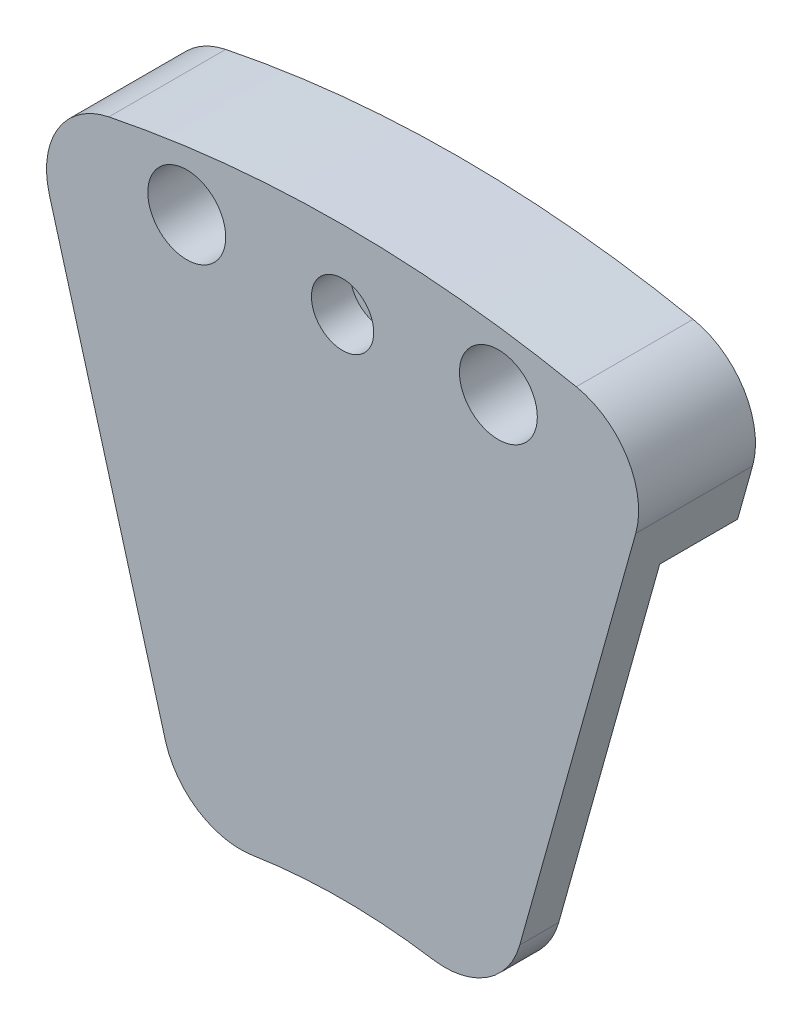
ISO-10303-21;
HEADER;
FILE_DESCRIPTION(('STEP AP214'),'2;1');
FILE_NAME('part.step','',(''),(''),'','','');
FILE_SCHEMA(('AUTOMOTIVE_DESIGN { 1 0 10303 214 1 1 1 1 }'));
ENDSEC;
DATA;
#1=APPLICATION_CONTEXT('core data for automotive mechanical design processes');
#2=APPLICATION_PROTOCOL_DEFINITION('international standard','automotive_design',2000,#1);
#3=PRODUCT_CONTEXT('',#1,'mechanical');
#4=PRODUCT('Part','Part','',(#3));
#5=PRODUCT_RELATED_PRODUCT_CATEGORY('part','',(#4));
#6=PRODUCT_DEFINITION_FORMATION('','',#4);
#7=PRODUCT_DEFINITION_CONTEXT('part definition',#1,'design');
#8=PRODUCT_DEFINITION('design','',#6,#7);
#9=PRODUCT_DEFINITION_SHAPE('','',#8);
#10=(LENGTH_UNIT() NAMED_UNIT(*) SI_UNIT(.MILLI.,.METRE.));
#11=(NAMED_UNIT(*) PLANE_ANGLE_UNIT() SI_UNIT($,.RADIAN.));
#12=(NAMED_UNIT(*) SI_UNIT($,.STERADIAN.) SOLID_ANGLE_UNIT());
#13=UNCERTAINTY_MEASURE_WITH_UNIT(LENGTH_MEASURE(1.E-05),#10,'distance_accuracy_value','');
#14=(GEOMETRIC_REPRESENTATION_CONTEXT(3) GLOBAL_UNCERTAINTY_ASSIGNED_CONTEXT((#13)) GLOBAL_UNIT_ASSIGNED_CONTEXT((#10,
#11,#12)) REPRESENTATION_CONTEXT('',''));
#15=CARTESIAN_POINT('',(0.,0.,0.));
#16=DIRECTION('',(0.,0.,1.));
#17=DIRECTION('',(1.,0.,0.));
#18=AXIS2_PLACEMENT_3D('',#15,#16,#17);
#19=CARTESIAN_POINT('',(20.,141.089510595225,-45.));
#20=DIRECTION('',(0.,0.,1.));
#21=DIRECTION('',(1.,0.,0.));
#22=AXIS2_PLACEMENT_3D('',#19,#20,#21);
#23=CYLINDRICAL_SURFACE('',#22,2.15000000000001);
#24=CARTESIAN_POINT('',(20.,141.089510595225,-10.));
#25=DIRECTION('',(0.,0.,-1.));
#26=DIRECTION('',(-1.,0.,0.));
#27=AXIS2_PLACEMENT_3D('',#24,#25,#26);
#28=CIRCLE('',#27,2.15000000000001);
#29=CARTESIAN_POINT('',(17.85,141.089510595225,-10.));
#30=VERTEX_POINT('',#29);
#31=EDGE_CURVE('E161',#30,#30,#28,.T.);
#32=ORIENTED_EDGE('',*,*,#31,.T.);
#33=EDGE_LOOP('',(#32));
#34=FACE_BOUND('',#33,.T.);
#35=CARTESIAN_POINT('',(20.,141.089510595225,-5.));
#36=DIRECTION('',(0.,0.,1.));
#37=DIRECTION('',(1.,0.,0.));
#38=AXIS2_PLACEMENT_3D('',#35,#36,#37);
#39=CIRCLE('',#38,2.15000000000001);
#40=CARTESIAN_POINT('',(22.15,141.089510595225,-5.));
#41=VERTEX_POINT('',#40);
#42=EDGE_CURVE('E39',#41,#41,#39,.F.);
#43=ORIENTED_EDGE('',*,*,#42,.F.);
#44=EDGE_LOOP('',(#43));
#45=FACE_BOUND('',#44,.T.);
#46=ADVANCED_FACE('F35',(#34,#45),#23,.F.);
#47=CARTESIAN_POINT('',(-20.,141.089510595225,-45.));
#48=DIRECTION('',(0.,0.,1.));
#49=DIRECTION('',(1.,0.,0.));
#50=AXIS2_PLACEMENT_3D('',#47,#48,#49);
#51=CYLINDRICAL_SURFACE('',#50,2.15);
#52=CARTESIAN_POINT('',(-20.,141.089510595225,-10.));
#53=DIRECTION('',(0.,0.,-1.));
#54=DIRECTION('',(-1.,0.,0.));
#55=AXIS2_PLACEMENT_3D('',#52,#53,#54);
#56=CIRCLE('',#55,2.15);
#57=CARTESIAN_POINT('',(-22.15,141.089510595225,-10.));
#58=VERTEX_POINT('',#57);
#59=EDGE_CURVE('E164',#58,#58,#56,.T.);
#60=ORIENTED_EDGE('',*,*,#59,.T.);
#61=EDGE_LOOP('',(#60));
#62=FACE_BOUND('',#61,.T.);
#63=CARTESIAN_POINT('',(-20.,141.089510595225,-5.));
#64=DIRECTION('',(0.,0.,1.));
#65=DIRECTION('',(1.,0.,0.));
#66=AXIS2_PLACEMENT_3D('',#63,#64,#65);
#67=CIRCLE('',#66,2.15);
#68=CARTESIAN_POINT('',(-17.85,141.089510595225,-5.));
#69=VERTEX_POINT('',#68);
#70=EDGE_CURVE('E166',#69,#69,#67,.F.);
#71=ORIENTED_EDGE('',*,*,#70,.F.);
#72=EDGE_LOOP('',(#71));
#73=FACE_BOUND('',#72,.T.);
#74=ADVANCED_FACE('F273',(#62,#73),#51,.F.);
#75=CARTESIAN_POINT('',(-28.,137.171425595858,0.));
#76=DIRECTION('',(0.,0.,1.));
#77=DIRECTION('',(1.,0.,0.));
#78=AXIS2_PLACEMENT_3D('',#75,#76,#77);
#79=PLANE('',#78);
#80=CARTESIAN_POINT('',(0.,-1.66533453693773E-13,0.));
#81=DIRECTION('',(0.,0.,1.));
#82=DIRECTION('',(-1.,0.,0.));
#83=AXIS2_PLACEMENT_3D('',#80,#81,#82);
#84=CIRCLE('',#83,132.5);
#85=CARTESIAN_POINT('',(35.7053798233847,127.598494707688,0.));
#86=VERTEX_POINT('',#85);
#87=CARTESIAN_POINT('',(-35.7053798233847,127.598494707688,0.));
#88=VERTEX_POINT('',#87);
#89=EDGE_CURVE('E52',#86,#88,#84,.T.);
#90=ORIENTED_EDGE('',*,*,#89,.F.);
#91=DIRECTION('',(0.269474564704791,0.963007507227832,0.));
#92=VECTOR('',#91,1.);
#93=CARTESIAN_POINT('',(22.746271228219,81.2871893056481,0.));
#94=LINE('',#93,#92);
#95=CARTESIAN_POINT('',(22.746271228219,81.2871893056481,0.));
#96=VERTEX_POINT('',#95);
#97=EDGE_CURVE('E147',#96,#86,#94,.T.);
#98=ORIENTED_EDGE('',*,*,#97,.F.);
#99=CARTESIAN_POINT('',(13.1161961559407,83.9819349526959,0.));
#100=DIRECTION('',(0.,0.,1.));
#101=DIRECTION('',(1.,0.,0.));
#102=AXIS2_PLACEMENT_3D('',#99,#100,#101);
#103=CIRCLE('',#102,9.99999999999993);
#104=CARTESIAN_POINT('',(11.5731142552418,74.1017073112023,0.));
#105=VERTEX_POINT('',#104);
#106=EDGE_CURVE('E82',#105,#96,#103,.T.);
#107=ORIENTED_EDGE('',*,*,#106,.F.);
#108=CARTESIAN_POINT('',(0.,-1.65700786425305E-13,0.));
#109=DIRECTION('',(0.,0.,-1.));
#110=DIRECTION('',(1.,0.,0.));
#111=AXIS2_PLACEMENT_3D('',#108,#109,#110);
#112=CIRCLE('',#111,75.);
#113=CARTESIAN_POINT('',(-11.5731142552418,74.1017073112023,0.));
#114=VERTEX_POINT('',#113);
#115=EDGE_CURVE('E143',#114,#105,#112,.T.);
#116=ORIENTED_EDGE('',*,*,#115,.F.);
#117=CARTESIAN_POINT('',(-13.1161961559407,83.9819349526959,0.));
#118=DIRECTION('',(0.,0.,1.));
#119=DIRECTION('',(1.,0.,0.));
#120=AXIS2_PLACEMENT_3D('',#117,#118,#119);
#121=CIRCLE('',#120,9.99999999999994);
#122=CARTESIAN_POINT('',(-22.7462712282191,81.2871893056481,0.));
#123=VERTEX_POINT('',#122);
#124=EDGE_CURVE('E140',#123,#114,#121,.T.);
#125=ORIENTED_EDGE('',*,*,#124,.F.);
#126=DIRECTION('',(0.269474564704791,-0.963007507227832,0.));
#127=VECTOR('',#126,1.);
#128=CARTESIAN_POINT('',(-37.6300750722784,134.47667994881,0.));
#129=LINE('',#128,#127);
#130=EDGE_CURVE('E138',#88,#123,#129,.T.);
#131=ORIENTED_EDGE('',*,*,#130,.F.);
#132=EDGE_LOOP('',(#90,#98,#107,#116,#125,#131));
#133=FACE_BOUND('',#132,.T.);
#134=ADVANCED_FACE('F226',(#133),#79,.F.);
#135=CARTESIAN_POINT('',(-28.,137.171425595858,5.));
#136=DIRECTION('',(0.,0.,1.));
#137=DIRECTION('',(1.,0.,0.));
#138=AXIS2_PLACEMENT_3D('',#135,#136,#137);
#139=PLANE('',#138);
#140=CARTESIAN_POINT('',(-20.,141.089510595225,5.));
#141=DIRECTION('',(0.,0.,1.));
#142=DIRECTION('',(1.,0.,0.));
#143=AXIS2_PLACEMENT_3D('',#140,#141,#142);
#144=CIRCLE('',#143,5.);
#145=CARTESIAN_POINT('',(-15.,141.089510595225,5.));
#146=VERTEX_POINT('',#145);
#147=EDGE_CURVE('E173',#146,#146,#144,.T.);
#148=ORIENTED_EDGE('',*,*,#147,.F.);
#149=EDGE_LOOP('',(#148));
#150=FACE_BOUND('',#149,.T.);
#151=CARTESIAN_POINT('',(20.,141.089510595225,5.));
#152=DIRECTION('',(0.,0.,1.));
#153=DIRECTION('',(1.,0.,0.));
#154=AXIS2_PLACEMENT_3D('',#151,#152,#153);
#155=CIRCLE('',#154,5.);
#156=CARTESIAN_POINT('',(25.,141.089510595225,5.));
#157=VERTEX_POINT('',#156);
#158=EDGE_CURVE('E183',#157,#157,#155,.T.);
#159=ORIENTED_EDGE('',*,*,#158,.F.);
#160=EDGE_LOOP('',(#159));
#161=FACE_BOUND('',#160,.T.);
#162=CARTESIAN_POINT('',(-28.,137.171425595858,5.));
#163=DIRECTION('',(0.,0.,1.));
#164=DIRECTION('',(1.,0.,0.));
#165=AXIS2_PLACEMENT_3D('',#162,#163,#164);
#166=CIRCLE('',#165,10.0000000000001);
#167=CARTESIAN_POINT('',(-30.,146.969384566991,5.));
#168=VERTEX_POINT('',#167);
#169=CARTESIAN_POINT('',(-37.6300750722784,134.47667994881,5.));
#170=VERTEX_POINT('',#169);
#171=EDGE_CURVE('E149',#168,#170,#166,.T.);
#172=ORIENTED_EDGE('',*,*,#171,.T.);
#173=DIRECTION('',(0.269474564704791,-0.963007507227832,0.));
#174=VECTOR('',#173,1.);
#175=CARTESIAN_POINT('',(-37.6300750722784,134.47667994881,5.));
#176=LINE('',#175,#174);
#177=CARTESIAN_POINT('',(-22.7462712282191,81.2871893056481,5.));
#178=VERTEX_POINT('',#177);
#179=EDGE_CURVE('E90',#170,#178,#176,.T.);
#180=ORIENTED_EDGE('',*,*,#179,.T.);
#181=CARTESIAN_POINT('',(-13.1161961559407,83.9819349526959,5.));
#182=DIRECTION('',(0.,0.,1.));
#183=DIRECTION('',(1.,0.,0.));
#184=AXIS2_PLACEMENT_3D('',#181,#182,#183);
#185=CIRCLE('',#184,9.99999999999998);
#186=CARTESIAN_POINT('',(-11.5731142552418,74.1017073112023,5.));
#187=VERTEX_POINT('',#186);
#188=EDGE_CURVE('E215',#178,#187,#185,.T.);
#189=ORIENTED_EDGE('',*,*,#188,.T.);
#190=CARTESIAN_POINT('',(0.,-1.65700786425305E-13,5.));
#191=DIRECTION('',(0.,0.,-1.));
#192=DIRECTION('',(1.,0.,0.));
#193=AXIS2_PLACEMENT_3D('',#190,#191,#192);
#194=CIRCLE('',#193,75.);
#195=CARTESIAN_POINT('',(11.5731142552418,74.1017073112023,5.));
#196=VERTEX_POINT('',#195);
#197=EDGE_CURVE('E217',#187,#196,#194,.T.);
#198=ORIENTED_EDGE('',*,*,#197,.T.);
#199=CARTESIAN_POINT('',(13.1161961559407,83.9819349526959,5.));
#200=DIRECTION('',(0.,0.,1.));
#201=DIRECTION('',(1.,0.,0.));
#202=AXIS2_PLACEMENT_3D('',#199,#200,#201);
#203=CIRCLE('',#202,9.99999999999993);
#204=CARTESIAN_POINT('',(22.746271228219,81.2871893056481,5.));
#205=VERTEX_POINT('',#204);
#206=EDGE_CURVE('E114',#196,#205,#203,.T.);
#207=ORIENTED_EDGE('',*,*,#206,.T.);
#208=DIRECTION('',(0.269474564704791,0.963007507227832,0.));
#209=VECTOR('',#208,1.);
#210=CARTESIAN_POINT('',(22.746271228219,81.2871893056481,5.));
#211=LINE('',#210,#209);
#212=CARTESIAN_POINT('',(37.6300750722783,134.47667994881,5.));
#213=VERTEX_POINT('',#212);
#214=EDGE_CURVE('E106',#205,#213,#211,.T.);
#215=ORIENTED_EDGE('',*,*,#214,.T.);
#216=CARTESIAN_POINT('',(28.,137.171425595858,5.));
#217=DIRECTION('',(0.,0.,1.));
#218=DIRECTION('',(1.,0.,0.));
#219=AXIS2_PLACEMENT_3D('',#216,#217,#218);
#220=CIRCLE('',#219,10.);
#221=CARTESIAN_POINT('',(30.,146.969384566991,5.));
#222=VERTEX_POINT('',#221);
#223=EDGE_CURVE('E111',#213,#222,#220,.T.);
#224=ORIENTED_EDGE('',*,*,#223,.T.);
#225=CARTESIAN_POINT('',(0.,-1.65700786425305E-13,5.));
#226=DIRECTION('',(0.,0.,1.));
#227=DIRECTION('',(1.,0.,0.));
#228=AXIS2_PLACEMENT_3D('',#225,#226,#227);
#229=CIRCLE('',#228,150.);
#230=EDGE_CURVE('E61',#222,#168,#229,.T.);
#231=ORIENTED_EDGE('',*,*,#230,.T.);
#232=EDGE_LOOP('',(#172,#180,#189,#198,#207,#215,#224,#231));
#233=FACE_BOUND('',#232,.T.);
#234=CARTESIAN_POINT('',(0.,140.,5.));
#235=DIRECTION('',(0.,0.,1.));
#236=DIRECTION('',(1.,0.,0.));
#237=AXIS2_PLACEMENT_3D('',#234,#235,#236);
#238=CIRCLE('',#237,3.99999999999999);
#239=CARTESIAN_POINT('',(3.99999999999998,140.,5.));
#240=VERTEX_POINT('',#239);
#241=EDGE_CURVE('E141',#240,#240,#238,.T.);
#242=ORIENTED_EDGE('',*,*,#241,.F.);
#243=EDGE_LOOP('',(#242));
#244=FACE_BOUND('',#243,.T.);
#245=ADVANCED_FACE('F108',(#150,#161,#233,#244),#139,.T.);
#246=CARTESIAN_POINT('',(-28.,137.171425595858,5.));
#247=DIRECTION('',(0.,0.,-1.));
#248=DIRECTION('',(-1.,0.,0.));
#249=AXIS2_PLACEMENT_3D('',#246,#247,#248);
#250=CYLINDRICAL_SURFACE('',#249,10.0000000000001);
#251=DIRECTION('',(0.,0.,-1.));
#252=VECTOR('',#251,1.);
#253=CARTESIAN_POINT('',(-30.,146.969384566991,5.));
#254=LINE('',#253,#252);
#255=CARTESIAN_POINT('',(-30.,146.969384566991,-10.));
#256=VERTEX_POINT('',#255);
#257=EDGE_CURVE('E134',#168,#256,#254,.T.);
#258=ORIENTED_EDGE('',*,*,#257,.T.);
#259=CARTESIAN_POINT('',(-28.,137.171425595858,-10.));
#260=DIRECTION('',(0.,0.,-1.));
#261=DIRECTION('',(-1.,0.,0.));
#262=AXIS2_PLACEMENT_3D('',#259,#260,#261);
#263=CIRCLE('',#262,10.0000000000001);
#264=CARTESIAN_POINT('',(-37.6300750722784,134.47667994881,-10.));
#265=VERTEX_POINT('',#264);
#266=EDGE_CURVE('E186',#265,#256,#263,.T.);
#267=ORIENTED_EDGE('',*,*,#266,.F.);
#268=DIRECTION('',(0.,0.,-1.));
#269=VECTOR('',#268,1.);
#270=CARTESIAN_POINT('',(-37.6300750722784,134.47667994881,5.));
#271=LINE('',#270,#269);
#272=EDGE_CURVE('E11',#170,#265,#271,.T.);
#273=ORIENTED_EDGE('',*,*,#272,.F.);
#274=ORIENTED_EDGE('',*,*,#171,.F.);
#275=EDGE_LOOP('',(#258,#267,#273,#274));
#276=FACE_BOUND('',#275,.T.);
#277=ADVANCED_FACE('F37',(#276),#250,.T.);
#278=CARTESIAN_POINT('',(-37.6300750722784,134.47667994881,5.));
#279=DIRECTION('',(0.963007507227832,0.269474564704791,0.));
#280=DIRECTION('',(-0.269474564704791,0.963007507227833,0.));
#281=AXIS2_PLACEMENT_3D('',#278,#279,#280);
#282=PLANE('',#281);
#283=ORIENTED_EDGE('',*,*,#272,.T.);
#284=DIRECTION('',(-0.269474564704792,0.963007507227832,0.));
#285=VECTOR('',#284,1.);
#286=CARTESIAN_POINT('',(-37.6300750722784,134.47667994881,-10.));
#287=LINE('',#286,#285);
#288=CARTESIAN_POINT('',(-35.7053798233847,127.598494707688,-10.));
#289=VERTEX_POINT('',#288);
#290=EDGE_CURVE('E198',#289,#265,#287,.T.);
#291=ORIENTED_EDGE('',*,*,#290,.F.);
#292=DIRECTION('',(0.,0.,1.));
#293=VECTOR('',#292,1.);
#294=CARTESIAN_POINT('',(-35.7053798233847,127.598494707688,-10.));
#295=LINE('',#294,#293);
#296=EDGE_CURVE('E201',#289,#88,#295,.T.);
#297=ORIENTED_EDGE('',*,*,#296,.T.);
#298=ORIENTED_EDGE('',*,*,#130,.T.);
#299=DIRECTION('',(0.,0.,-1.));
#300=VECTOR('',#299,1.);
#301=CARTESIAN_POINT('',(-22.7462712282191,81.2871893056481,5.));
#302=LINE('',#301,#300);
#303=EDGE_CURVE('E44',#178,#123,#302,.T.);
#304=ORIENTED_EDGE('',*,*,#303,.F.);
#305=ORIENTED_EDGE('',*,*,#179,.F.);
#306=EDGE_LOOP('',(#283,#291,#297,#298,#304,#305));
#307=FACE_BOUND('',#306,.T.);
#308=ADVANCED_FACE('F230',(#307),#282,.F.);
#309=CARTESIAN_POINT('',(-13.1161961559407,83.9819349526959,5.));
#310=DIRECTION('',(0.,0.,-1.));
#311=DIRECTION('',(-1.,0.,0.));
#312=AXIS2_PLACEMENT_3D('',#309,#310,#311);
#313=CYLINDRICAL_SURFACE('',#312,9.99999999999994);
#314=ORIENTED_EDGE('',*,*,#124,.T.);
#315=DIRECTION('',(0.,0.,-1.));
#316=VECTOR('',#315,1.);
#317=CARTESIAN_POINT('',(-11.5731142552418,74.1017073112023,5.));
#318=LINE('',#317,#316);
#319=EDGE_CURVE('E156',#187,#114,#318,.T.);
#320=ORIENTED_EDGE('',*,*,#319,.F.);
#321=ORIENTED_EDGE('',*,*,#188,.F.);
#322=ORIENTED_EDGE('',*,*,#303,.T.);
#323=EDGE_LOOP('',(#314,#320,#321,#322));
#324=FACE_BOUND('',#323,.T.);
#325=ADVANCED_FACE('F229',(#324),#313,.T.);
#326=CARTESIAN_POINT('',(0.,-1.65700786425305E-13,5.));
#327=DIRECTION('',(0.,0.,-1.));
#328=DIRECTION('',(-1.,0.,0.));
#329=AXIS2_PLACEMENT_3D('',#326,#327,#328);
#330=CYLINDRICAL_SURFACE('',#329,75.);
#331=ORIENTED_EDGE('',*,*,#115,.T.);
#332=DIRECTION('',(0.,0.,-1.));
#333=VECTOR('',#332,1.);
#334=CARTESIAN_POINT('',(11.5731142552418,74.1017073112023,5.));
#335=LINE('',#334,#333);
#336=EDGE_CURVE('E154',#196,#105,#335,.T.);
#337=ORIENTED_EDGE('',*,*,#336,.F.);
#338=ORIENTED_EDGE('',*,*,#197,.F.);
#339=ORIENTED_EDGE('',*,*,#319,.T.);
#340=EDGE_LOOP('',(#331,#337,#338,#339));
#341=FACE_BOUND('',#340,.T.);
#342=ADVANCED_FACE('F223',(#341),#330,.F.);
#343=CARTESIAN_POINT('',(13.1161961559407,83.9819349526959,5.));
#344=DIRECTION('',(0.,0.,-1.));
#345=DIRECTION('',(-1.,0.,0.));
#346=AXIS2_PLACEMENT_3D('',#343,#344,#345);
#347=CYLINDRICAL_SURFACE('',#346,9.99999999999993);
#348=ORIENTED_EDGE('',*,*,#106,.T.);
#349=DIRECTION('',(0.,0.,-1.));
#350=VECTOR('',#349,1.);
#351=CARTESIAN_POINT('',(22.746271228219,81.2871893056481,5.));
#352=LINE('',#351,#350);
#353=EDGE_CURVE('E128',#205,#96,#352,.T.);
#354=ORIENTED_EDGE('',*,*,#353,.F.);
#355=ORIENTED_EDGE('',*,*,#206,.F.);
#356=ORIENTED_EDGE('',*,*,#336,.T.);
#357=EDGE_LOOP('',(#348,#354,#355,#356));
#358=FACE_BOUND('',#357,.T.);
#359=ADVANCED_FACE('F225',(#358),#347,.T.);
#360=CARTESIAN_POINT('',(22.746271228219,81.2871893056481,5.));
#361=DIRECTION('',(-0.963007507227832,0.269474564704791,0.));
#362=DIRECTION('',(-0.269474564704791,-0.963007507227832,0.));
#363=AXIS2_PLACEMENT_3D('',#360,#361,#362);
#364=PLANE('',#363);
#365=ORIENTED_EDGE('',*,*,#97,.T.);
#366=DIRECTION('',(0.,0.,1.));
#367=VECTOR('',#366,1.);
#368=CARTESIAN_POINT('',(35.7053798233847,127.598494707688,-10.));
#369=LINE('',#368,#367);
#370=CARTESIAN_POINT('',(35.7053798233847,127.598494707688,-10.));
#371=VERTEX_POINT('',#370);
#372=EDGE_CURVE('E205',#371,#86,#369,.T.);
#373=ORIENTED_EDGE('',*,*,#372,.F.);
#374=DIRECTION('',(-0.269474564704792,-0.963007507227832,0.));
#375=VECTOR('',#374,1.);
#376=CARTESIAN_POINT('',(35.7053798233847,127.598494707688,-10.));
#377=LINE('',#376,#375);
#378=CARTESIAN_POINT('',(37.6300750722783,134.47667994881,-10.));
#379=VERTEX_POINT('',#378);
#380=EDGE_CURVE('E124',#379,#371,#377,.T.);
#381=ORIENTED_EDGE('',*,*,#380,.F.);
#382=DIRECTION('',(0.,0.,-1.));
#383=VECTOR('',#382,1.);
#384=CARTESIAN_POINT('',(37.6300750722783,134.47667994881,5.));
#385=LINE('',#384,#383);
#386=EDGE_CURVE('E119',#213,#379,#385,.T.);
#387=ORIENTED_EDGE('',*,*,#386,.F.);
#388=ORIENTED_EDGE('',*,*,#214,.F.);
#389=ORIENTED_EDGE('',*,*,#353,.T.);
#390=EDGE_LOOP('',(#365,#373,#381,#387,#388,#389));
#391=FACE_BOUND('',#390,.T.);
#392=ADVANCED_FACE('F120',(#391),#364,.F.);
#393=CARTESIAN_POINT('',(28.,137.171425595858,5.));
#394=DIRECTION('',(0.,0.,-1.));
#395=DIRECTION('',(-1.,0.,0.));
#396=AXIS2_PLACEMENT_3D('',#393,#394,#395);
#397=CYLINDRICAL_SURFACE('',#396,10.);
#398=ORIENTED_EDGE('',*,*,#386,.T.);
#399=CARTESIAN_POINT('',(28.,137.171425595858,-10.));
#400=DIRECTION('',(0.,0.,-1.));
#401=DIRECTION('',(-1.,0.,0.));
#402=AXIS2_PLACEMENT_3D('',#399,#400,#401);
#403=CIRCLE('',#402,10.);
#404=CARTESIAN_POINT('',(30.,146.969384566991,-10.));
#405=VERTEX_POINT('',#404);
#406=EDGE_CURVE('E192',#405,#379,#403,.T.);
#407=ORIENTED_EDGE('',*,*,#406,.F.);
#408=DIRECTION('',(0.,0.,-1.));
#409=VECTOR('',#408,1.);
#410=CARTESIAN_POINT('',(30.,146.969384566991,5.));
#411=LINE('',#410,#409);
#412=EDGE_CURVE('E129',#222,#405,#411,.T.);
#413=ORIENTED_EDGE('',*,*,#412,.F.);
#414=ORIENTED_EDGE('',*,*,#223,.F.);
#415=EDGE_LOOP('',(#398,#407,#413,#414));
#416=FACE_BOUND('',#415,.T.);
#417=ADVANCED_FACE('F131',(#416),#397,.T.);
#418=CARTESIAN_POINT('',(0.,-1.65700786425305E-13,5.));
#419=DIRECTION('',(0.,0.,-1.));
#420=DIRECTION('',(-1.,0.,0.));
#421=AXIS2_PLACEMENT_3D('',#418,#419,#420);
#422=CYLINDRICAL_SURFACE('',#421,150.);
#423=ORIENTED_EDGE('',*,*,#412,.T.);
#424=CARTESIAN_POINT('',(0.,-1.65700786425305E-13,-10.));
#425=DIRECTION('',(0.,0.,-1.));
#426=DIRECTION('',(-1.,0.,0.));
#427=AXIS2_PLACEMENT_3D('',#424,#425,#426);
#428=CIRCLE('',#427,150.);
#429=EDGE_CURVE('E189',#256,#405,#428,.T.);
#430=ORIENTED_EDGE('',*,*,#429,.F.);
#431=ORIENTED_EDGE('',*,*,#257,.F.);
#432=ORIENTED_EDGE('',*,*,#230,.F.);
#433=EDGE_LOOP('',(#423,#430,#431,#432));
#434=FACE_BOUND('',#433,.T.);
#435=ADVANCED_FACE('F252',(#434),#422,.T.);
#436=CARTESIAN_POINT('',(0.,140.,5.));
#437=DIRECTION('',(0.,0.,-1.));
#438=DIRECTION('',(-1.,0.,0.));
#439=AXIS2_PLACEMENT_3D('',#436,#437,#438);
#440=CYLINDRICAL_SURFACE('',#439,3.99999999999999);
#441=CARTESIAN_POINT('',(0.,140.,0.));
#442=DIRECTION('',(0.,0.,1.));
#443=DIRECTION('',(1.,0.,0.));
#444=AXIS2_PLACEMENT_3D('',#441,#442,#443);
#445=CIRCLE('',#444,3.99999999999999);
#446=CARTESIAN_POINT('',(3.99999999999998,140.,0.));
#447=VERTEX_POINT('',#446);
#448=EDGE_CURVE('E208',#447,#447,#445,.T.);
#449=ORIENTED_EDGE('',*,*,#448,.F.);
#450=EDGE_LOOP('',(#449));
#451=FACE_BOUND('',#450,.T.);
#452=ORIENTED_EDGE('',*,*,#241,.T.);
#453=EDGE_LOOP('',(#452));
#454=FACE_BOUND('',#453,.T.);
#455=ADVANCED_FACE('F255',(#451,#454),#440,.F.);
#456=CARTESIAN_POINT('',(-28.,137.171425595858,-10.));
#457=DIRECTION('',(0.,0.,-1.));
#458=DIRECTION('',(-1.,0.,0.));
#459=AXIS2_PLACEMENT_3D('',#456,#457,#458);
#460=PLANE('',#459);
#461=ORIENTED_EDGE('',*,*,#59,.F.);
#462=EDGE_LOOP('',(#461));
#463=FACE_BOUND('',#462,.T.);
#464=ORIENTED_EDGE('',*,*,#31,.F.);
#465=EDGE_LOOP('',(#464));
#466=FACE_BOUND('',#465,.T.);
#467=ORIENTED_EDGE('',*,*,#266,.T.);
#468=ORIENTED_EDGE('',*,*,#429,.T.);
#469=ORIENTED_EDGE('',*,*,#406,.T.);
#470=ORIENTED_EDGE('',*,*,#380,.T.);
#471=CARTESIAN_POINT('',(0.,-1.66533453693773E-13,-10.));
#472=DIRECTION('',(0.,0.,1.));
#473=DIRECTION('',(-1.,0.,0.));
#474=AXIS2_PLACEMENT_3D('',#471,#472,#473);
#475=CIRCLE('',#474,132.5);
#476=EDGE_CURVE('E195',#371,#289,#475,.T.);
#477=ORIENTED_EDGE('',*,*,#476,.T.);
#478=ORIENTED_EDGE('',*,*,#290,.T.);
#479=EDGE_LOOP('',(#467,#468,#469,#470,#477,#478));
#480=FACE_BOUND('',#479,.T.);
#481=ADVANCED_FACE('F253',(#463,#466,#480),#460,.T.);
#482=CARTESIAN_POINT('',(0.,-1.66533453693773E-13,-10.));
#483=DIRECTION('',(0.,0.,1.));
#484=DIRECTION('',(1.,0.,0.));
#485=AXIS2_PLACEMENT_3D('',#482,#483,#484);
#486=CYLINDRICAL_SURFACE('',#485,132.5);
#487=ORIENTED_EDGE('',*,*,#89,.T.);
#488=ORIENTED_EDGE('',*,*,#296,.F.);
#489=ORIENTED_EDGE('',*,*,#476,.F.);
#490=ORIENTED_EDGE('',*,*,#372,.T.);
#491=EDGE_LOOP('',(#487,#488,#489,#490));
#492=FACE_BOUND('',#491,.T.);
#493=ADVANCED_FACE('F237',(#492),#486,.F.);
#494=CARTESIAN_POINT('',(-28.,137.171425595858,0.));
#495=DIRECTION('',(0.,0.,-1.));
#496=DIRECTION('',(-1.,0.,0.));
#497=AXIS2_PLACEMENT_3D('',#494,#495,#496);
#498=PLANE('',#497);
#499=ORIENTED_EDGE('',*,*,#448,.T.);
#500=EDGE_LOOP('',(#499));
#501=FACE_BOUND('',#500,.T.);
#502=ADVANCED_FACE('F263',(#501),#498,.F.);
#503=CARTESIAN_POINT('',(-20.,141.089510595225,-5.));
#504=DIRECTION('',(0.,0.,1.));
#505=DIRECTION('',(1.,0.,0.));
#506=AXIS2_PLACEMENT_3D('',#503,#504,#505);
#507=PLANE('',#506);
#508=CARTESIAN_POINT('',(-20.,141.089510595225,-5.));
#509=DIRECTION('',(0.,0.,1.));
#510=DIRECTION('',(1.,0.,0.));
#511=AXIS2_PLACEMENT_3D('',#508,#509,#510);
#512=CIRCLE('',#511,5.);
#513=CARTESIAN_POINT('',(-15.,141.089510595225,-5.));
#514=VERTEX_POINT('',#513);
#515=EDGE_CURVE('E168',#514,#514,#512,.T.);
#516=ORIENTED_EDGE('',*,*,#515,.T.);
#517=EDGE_LOOP('',(#516));
#518=FACE_BOUND('',#517,.T.);
#519=ORIENTED_EDGE('',*,*,#70,.T.);
#520=EDGE_LOOP('',(#519));
#521=FACE_BOUND('',#520,.T.);
#522=ADVANCED_FACE('F293',(#518,#521),#507,.T.);
#523=CARTESIAN_POINT('',(-20.,141.089510595225,-5.));
#524=DIRECTION('',(0.,0.,1.));
#525=DIRECTION('',(1.,0.,0.));
#526=AXIS2_PLACEMENT_3D('',#523,#524,#525);
#527=CYLINDRICAL_SURFACE('',#526,5.);
#528=ORIENTED_EDGE('',*,*,#515,.F.);
#529=EDGE_LOOP('',(#528));
#530=FACE_BOUND('',#529,.T.);
#531=ORIENTED_EDGE('',*,*,#147,.T.);
#532=EDGE_LOOP('',(#531));
#533=FACE_BOUND('',#532,.T.);
#534=ADVANCED_FACE('F289',(#530,#533),#527,.F.);
#535=CARTESIAN_POINT('',(20.,141.089510595225,-5.));
#536=DIRECTION('',(0.,0.,1.));
#537=DIRECTION('',(1.,0.,0.));
#538=AXIS2_PLACEMENT_3D('',#535,#536,#537);
#539=PLANE('',#538);
#540=CARTESIAN_POINT('',(20.,141.089510595225,-5.));
#541=DIRECTION('',(0.,0.,1.));
#542=DIRECTION('',(1.,0.,0.));
#543=AXIS2_PLACEMENT_3D('',#540,#541,#542);
#544=CIRCLE('',#543,5.);
#545=CARTESIAN_POINT('',(25.,141.089510595225,-5.));
#546=VERTEX_POINT('',#545);
#547=EDGE_CURVE('E178',#546,#546,#544,.T.);
#548=ORIENTED_EDGE('',*,*,#547,.T.);
#549=EDGE_LOOP('',(#548));
#550=FACE_BOUND('',#549,.T.);
#551=ORIENTED_EDGE('',*,*,#42,.T.);
#552=EDGE_LOOP('',(#551));
#553=FACE_BOUND('',#552,.T.);
#554=ADVANCED_FACE('F285',(#550,#553),#539,.T.);
#555=CARTESIAN_POINT('',(20.,141.089510595225,-5.));
#556=DIRECTION('',(0.,0.,1.));
#557=DIRECTION('',(1.,0.,0.));
#558=AXIS2_PLACEMENT_3D('',#555,#556,#557);
#559=CYLINDRICAL_SURFACE('',#558,5.);
#560=ORIENTED_EDGE('',*,*,#547,.F.);
#561=EDGE_LOOP('',(#560));
#562=FACE_BOUND('',#561,.T.);
#563=ORIENTED_EDGE('',*,*,#158,.T.);
#564=EDGE_LOOP('',(#563));
#565=FACE_BOUND('',#564,.T.);
#566=ADVANCED_FACE('F282',(#562,#565),#559,.F.);
#567=CLOSED_SHELL('',(#46,#74,#134,#245,#277,#308,#325,#342,#359,#392,#417,#435,#455,#481,#493,
#502,#522,#534,#554,#566));
#568=MANIFOLD_SOLID_BREP('B2',#567);
#569=ADVANCED_BREP_SHAPE_REPRESENTATION('',(#18,#568),#14);
#570=SHAPE_DEFINITION_REPRESENTATION(#9,#569);
ENDSEC;
END-ISO-10303-21;
